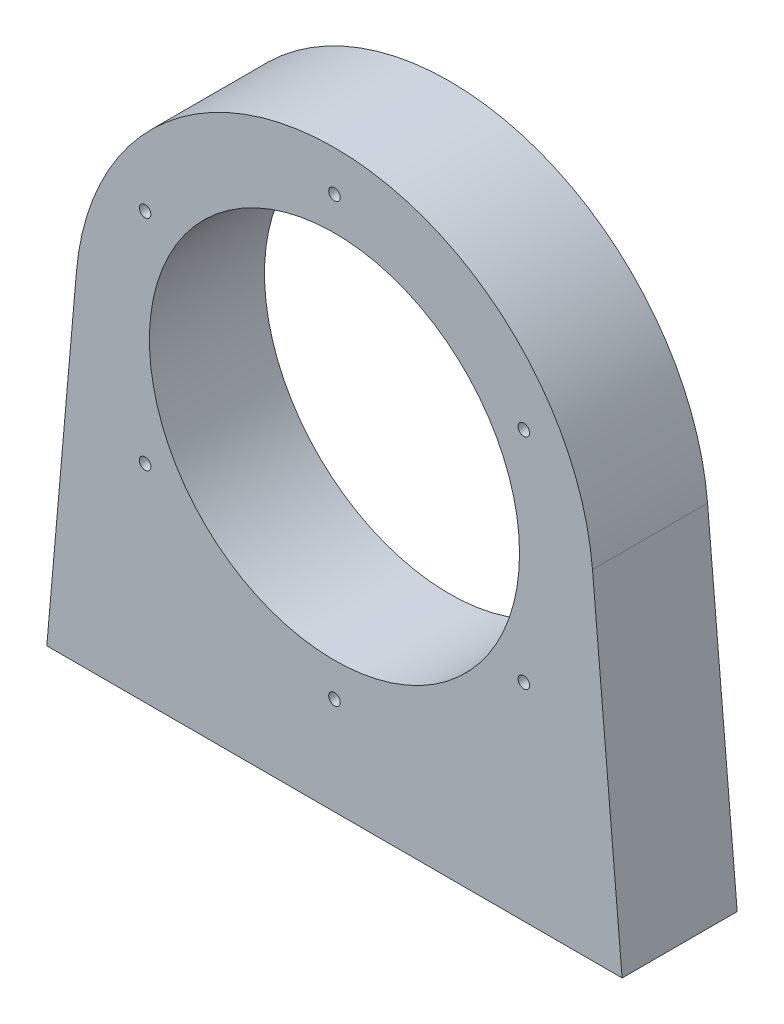
ISO-10303-21;
HEADER;
FILE_DESCRIPTION(('STEP AP214'),'2;1');
FILE_NAME('part.step','',(''),(''),'','','');
FILE_SCHEMA(('AUTOMOTIVE_DESIGN { 1 0 10303 214 1 1 1 1 }'));
ENDSEC;
DATA;
#1=APPLICATION_CONTEXT('core data for automotive mechanical design processes');
#2=APPLICATION_PROTOCOL_DEFINITION('international standard','automotive_design',2000,#1);
#3=PRODUCT_CONTEXT('',#1,'mechanical');
#4=PRODUCT('Part','Part','',(#3));
#5=PRODUCT_RELATED_PRODUCT_CATEGORY('part','',(#4));
#6=PRODUCT_DEFINITION_FORMATION('','',#4);
#7=PRODUCT_DEFINITION_CONTEXT('part definition',#1,'design');
#8=PRODUCT_DEFINITION('design','',#6,#7);
#9=PRODUCT_DEFINITION_SHAPE('','',#8);
#10=(LENGTH_UNIT() NAMED_UNIT(*) SI_UNIT(.MILLI.,.METRE.));
#11=(NAMED_UNIT(*) PLANE_ANGLE_UNIT() SI_UNIT($,.RADIAN.));
#12=(NAMED_UNIT(*) SI_UNIT($,.STERADIAN.) SOLID_ANGLE_UNIT());
#13=UNCERTAINTY_MEASURE_WITH_UNIT(LENGTH_MEASURE(1.E-05),#10,'distance_accuracy_value','');
#14=(GEOMETRIC_REPRESENTATION_CONTEXT(3) GLOBAL_UNCERTAINTY_ASSIGNED_CONTEXT((#13)) GLOBAL_UNIT_ASSIGNED_CONTEXT((#10,
#11,#12)) REPRESENTATION_CONTEXT('',''));
#15=CARTESIAN_POINT('',(0.,0.,0.));
#16=DIRECTION('',(0.,0.,1.));
#17=DIRECTION('',(1.,0.,0.));
#18=AXIS2_PLACEMENT_3D('',#15,#16,#17);
#19=CARTESIAN_POINT('',(148.861493596414,13.0184393729418,30.));
#20=DIRECTION('',(-0.996197750102571,-0.0871208510666442,0.));
#21=DIRECTION('',(0.0871208510666442,-0.996197750102571,0.));
#22=AXIS2_PLACEMENT_3D('',#19,#20,#21);
#23=PLANE('',#22);
#24=DIRECTION('',(-0.0871208510666443,0.996197750102571,0.));
#25=VECTOR('',#24,1.);
#26=CARTESIAN_POINT('',(148.861493596414,13.0184393729418,0.));
#27=LINE('',#26,#25);
#28=CARTESIAN_POINT('',(150.,0.,0.));
#29=VERTEX_POINT('',#28);
#30=CARTESIAN_POINT('',(142.273206422801,88.3532964023038,0.));
#31=VERTEX_POINT('',#30);
#32=EDGE_CURVE('E119',#29,#31,#27,.T.);
#33=ORIENTED_EDGE('',*,*,#32,.T.);
#34=DIRECTION('',(0.,0.,-1.));
#35=VECTOR('',#34,1.);
#36=CARTESIAN_POINT('',(142.273206422801,88.3532964023038,30.));
#37=LINE('',#36,#35);
#38=CARTESIAN_POINT('',(142.273206422801,88.3532964023038,30.));
#39=VERTEX_POINT('',#38);
#40=EDGE_CURVE('E11',#39,#31,#37,.T.);
#41=ORIENTED_EDGE('',*,*,#40,.F.);
#42=DIRECTION('',(-0.0871208510666443,0.996197750102571,0.));
#43=VECTOR('',#42,1.);
#44=CARTESIAN_POINT('',(148.861493596414,13.0184393729418,30.));
#45=LINE('',#44,#43);
#46=CARTESIAN_POINT('',(150.,0.,30.));
#47=VERTEX_POINT('',#46);
#48=EDGE_CURVE('E87',#47,#39,#45,.T.);
#49=ORIENTED_EDGE('',*,*,#48,.F.);
#50=DIRECTION('',(0.,0.,-1.));
#51=VECTOR('',#50,1.);
#52=CARTESIAN_POINT('',(150.,0.,30.));
#53=LINE('',#52,#51);
#54=EDGE_CURVE('E118',#47,#29,#53,.T.);
#55=ORIENTED_EDGE('',*,*,#54,.T.);
#56=EDGE_LOOP('',(#33,#41,#49,#55));
#57=FACE_BOUND('',#56,.T.);
#58=ADVANCED_FACE('F47',(#57),#23,.F.);
#59=CARTESIAN_POINT('',(75.,82.4700277471266,30.));
#60=DIRECTION('',(0.,0.,-1.));
#61=DIRECTION('',(-1.,0.,0.));
#62=AXIS2_PLACEMENT_3D('',#59,#60,#61);
#63=CYLINDRICAL_SURFACE('',#62,67.5299722528733);
#64=CARTESIAN_POINT('',(75.,82.4700277471266,0.));
#65=DIRECTION('',(0.,0.,1.));
#66=DIRECTION('',(1.,0.,0.));
#67=AXIS2_PLACEMENT_3D('',#64,#65,#66);
#68=CIRCLE('',#67,67.5299722528733);
#69=CARTESIAN_POINT('',(7.72679357719853,88.3532964023038,0.));
#70=VERTEX_POINT('',#69);
#71=EDGE_CURVE('E96',#70,#31,#68,.F.);
#72=ORIENTED_EDGE('',*,*,#71,.F.);
#73=DIRECTION('',(0.,0.,-1.));
#74=VECTOR('',#73,1.);
#75=CARTESIAN_POINT('',(7.72679357719853,88.3532964023038,30.));
#76=LINE('',#75,#74);
#77=CARTESIAN_POINT('',(7.72679357719853,88.3532964023038,30.));
#78=VERTEX_POINT('',#77);
#79=EDGE_CURVE('E56',#78,#70,#76,.T.);
#80=ORIENTED_EDGE('',*,*,#79,.F.);
#81=CARTESIAN_POINT('',(75.,82.4700277471266,30.));
#82=DIRECTION('',(0.,0.,1.));
#83=DIRECTION('',(1.,0.,0.));
#84=AXIS2_PLACEMENT_3D('',#81,#82,#83);
#85=CIRCLE('',#84,67.5299722528733);
#86=EDGE_CURVE('E94',#78,#39,#85,.F.);
#87=ORIENTED_EDGE('',*,*,#86,.T.);
#88=ORIENTED_EDGE('',*,*,#40,.T.);
#89=EDGE_LOOP('',(#72,#80,#87,#88));
#90=FACE_BOUND('',#89,.T.);
#91=ADVANCED_FACE('F93',(#90),#63,.T.);
#92=CARTESIAN_POINT('',(0.,0.,30.));
#93=DIRECTION('',(-0.996197750102571,0.0871208510666441,0.));
#94=DIRECTION('',(-0.0871208510666441,-0.996197750102571,0.));
#95=AXIS2_PLACEMENT_3D('',#92,#93,#94);
#96=PLANE('',#95);
#97=DIRECTION('',(0.0871208510666441,0.996197750102571,0.));
#98=VECTOR('',#97,1.);
#99=CARTESIAN_POINT('',(0.,0.,0.));
#100=LINE('',#99,#98);
#101=CARTESIAN_POINT('',(0.,0.,0.));
#102=VERTEX_POINT('',#101);
#103=EDGE_CURVE('E126',#102,#70,#100,.T.);
#104=ORIENTED_EDGE('',*,*,#103,.F.);
#105=DIRECTION('',(0.,0.,-1.));
#106=VECTOR('',#105,1.);
#107=CARTESIAN_POINT('',(0.,0.,30.));
#108=LINE('',#107,#106);
#109=CARTESIAN_POINT('',(0.,0.,30.));
#110=VERTEX_POINT('',#109);
#111=EDGE_CURVE('E79',#110,#102,#108,.T.);
#112=ORIENTED_EDGE('',*,*,#111,.F.);
#113=DIRECTION('',(0.0871208510666441,0.996197750102571,0.));
#114=VECTOR('',#113,1.);
#115=CARTESIAN_POINT('',(0.,0.,30.));
#116=LINE('',#115,#114);
#117=EDGE_CURVE('E104',#110,#78,#116,.T.);
#118=ORIENTED_EDGE('',*,*,#117,.T.);
#119=ORIENTED_EDGE('',*,*,#79,.T.);
#120=EDGE_LOOP('',(#104,#112,#118,#119));
#121=FACE_BOUND('',#120,.T.);
#122=ADVANCED_FACE('F107',(#121),#96,.T.);
#123=CARTESIAN_POINT('',(0.,0.,30.));
#124=DIRECTION('',(0.,1.,0.));
#125=DIRECTION('',(0.,0.,1.));
#126=AXIS2_PLACEMENT_3D('',#123,#124,#125);
#127=PLANE('',#126);
#128=DIRECTION('',(1.,0.,0.));
#129=VECTOR('',#128,1.);
#130=CARTESIAN_POINT('',(0.,0.,0.));
#131=LINE('',#130,#129);
#132=EDGE_CURVE('E82',#102,#29,#131,.T.);
#133=ORIENTED_EDGE('',*,*,#132,.T.);
#134=ORIENTED_EDGE('',*,*,#54,.F.);
#135=DIRECTION('',(1.,0.,0.));
#136=VECTOR('',#135,1.);
#137=CARTESIAN_POINT('',(0.,0.,30.));
#138=LINE('',#137,#136);
#139=EDGE_CURVE('E64',#110,#47,#138,.T.);
#140=ORIENTED_EDGE('',*,*,#139,.F.);
#141=ORIENTED_EDGE('',*,*,#111,.T.);
#142=EDGE_LOOP('',(#133,#134,#140,#141));
#143=FACE_BOUND('',#142,.T.);
#144=ADVANCED_FACE('F151',(#143),#127,.F.);
#145=CARTESIAN_POINT('',(75.,82.4700277471266,30.));
#146=DIRECTION('',(0.,0.,-1.));
#147=DIRECTION('',(-1.,0.,0.));
#148=AXIS2_PLACEMENT_3D('',#145,#146,#147);
#149=CYLINDRICAL_SURFACE('',#148,48.25);
#150=CARTESIAN_POINT('',(75.,82.4700277471266,30.));
#151=DIRECTION('',(0.,0.,1.));
#152=DIRECTION('',(1.,0.,0.));
#153=AXIS2_PLACEMENT_3D('',#150,#151,#152);
#154=CIRCLE('',#153,48.25);
#155=CARTESIAN_POINT('',(123.25,82.4700277471266,30.));
#156=VERTEX_POINT('',#155);
#157=EDGE_CURVE('E111',#156,#156,#154,.T.);
#158=ORIENTED_EDGE('',*,*,#157,.T.);
#159=EDGE_LOOP('',(#158));
#160=FACE_BOUND('',#159,.T.);
#161=CARTESIAN_POINT('',(75.,82.4700277471266,0.));
#162=DIRECTION('',(0.,0.,1.));
#163=DIRECTION('',(1.,0.,0.));
#164=AXIS2_PLACEMENT_3D('',#161,#162,#163);
#165=CIRCLE('',#164,48.25);
#166=CARTESIAN_POINT('',(123.25,82.4700277471266,0.));
#167=VERTEX_POINT('',#166);
#168=EDGE_CURVE('E131',#167,#167,#165,.T.);
#169=ORIENTED_EDGE('',*,*,#168,.F.);
#170=EDGE_LOOP('',(#169));
#171=FACE_BOUND('',#170,.T.);
#172=ADVANCED_FACE('F149',(#160,#171),#149,.F.);
#173=CARTESIAN_POINT('',(0.,0.,30.));
#174=DIRECTION('',(0.,0.,1.));
#175=DIRECTION('',(1.,0.,0.));
#176=AXIS2_PLACEMENT_3D('',#173,#174,#175);
#177=PLANE('',#176);
#178=CARTESIAN_POINT('',(75.,139.470027747127,30.));
#179=DIRECTION('',(0.,0.,1.));
#180=DIRECTION('',(1.,0.,0.));
#181=AXIS2_PLACEMENT_3D('',#178,#179,#180);
#182=CIRCLE('',#181,1.5);
#183=CARTESIAN_POINT('',(76.5,139.470027747127,30.));
#184=VERTEX_POINT('',#183);
#185=EDGE_CURVE('E264',#184,#184,#182,.T.);
#186=ORIENTED_EDGE('',*,*,#185,.F.);
#187=EDGE_LOOP('',(#186));
#188=FACE_BOUND('',#187,.T.);
#189=CARTESIAN_POINT('',(25.6365519842885,110.970027747125,30.));
#190=DIRECTION('',(0.,0.,1.));
#191=DIRECTION('',(1.,0.,0.));
#192=AXIS2_PLACEMENT_3D('',#189,#190,#191);
#193=CIRCLE('',#192,1.5);
#194=CARTESIAN_POINT('',(27.1365519842885,110.970027747125,30.));
#195=VERTEX_POINT('',#194);
#196=EDGE_CURVE('E277',#195,#195,#193,.T.);
#197=ORIENTED_EDGE('',*,*,#196,.F.);
#198=EDGE_LOOP('',(#197));
#199=FACE_BOUND('',#198,.T.);
#200=CARTESIAN_POINT('',(25.6365519842904,53.970027747125,30.));
#201=DIRECTION('',(0.,0.,1.));
#202=DIRECTION('',(1.,0.,0.));
#203=AXIS2_PLACEMENT_3D('',#200,#201,#202);
#204=CIRCLE('',#203,1.50000000000002);
#205=CARTESIAN_POINT('',(27.1365519842904,53.970027747125,30.));
#206=VERTEX_POINT('',#205);
#207=EDGE_CURVE('E302',#206,#206,#204,.T.);
#208=ORIENTED_EDGE('',*,*,#207,.F.);
#209=EDGE_LOOP('',(#208));
#210=FACE_BOUND('',#209,.T.);
#211=CARTESIAN_POINT('',(75.0000000000045,25.4700277471266,30.));
#212=DIRECTION('',(0.,0.,1.));
#213=DIRECTION('',(1.,0.,0.));
#214=AXIS2_PLACEMENT_3D('',#211,#212,#213);
#215=CIRCLE('',#214,1.5);
#216=CARTESIAN_POINT('',(76.5000000000045,25.4700277471266,30.));
#217=VERTEX_POINT('',#216);
#218=EDGE_CURVE('E294',#217,#217,#215,.T.);
#219=ORIENTED_EDGE('',*,*,#218,.F.);
#220=EDGE_LOOP('',(#219));
#221=FACE_BOUND('',#220,.T.);
#222=CARTESIAN_POINT('',(124.363448015717,53.9700277471285,30.));
#223=DIRECTION('',(0.,0.,1.));
#224=DIRECTION('',(1.,0.,0.));
#225=AXIS2_PLACEMENT_3D('',#222,#223,#224);
#226=CIRCLE('',#225,1.5);
#227=CARTESIAN_POINT('',(125.863448015717,53.9700277471285,30.));
#228=VERTEX_POINT('',#227);
#229=EDGE_CURVE('E286',#228,#228,#226,.T.);
#230=ORIENTED_EDGE('',*,*,#229,.F.);
#231=EDGE_LOOP('',(#230));
#232=FACE_BOUND('',#231,.T.);
#233=CARTESIAN_POINT('',(124.363448015714,110.970027747129,30.));
#234=DIRECTION('',(0.,0.,1.));
#235=DIRECTION('',(1.,0.,0.));
#236=AXIS2_PLACEMENT_3D('',#233,#234,#235);
#237=CIRCLE('',#236,1.49999999999998);
#238=CARTESIAN_POINT('',(125.863448015714,110.970027747129,30.));
#239=VERTEX_POINT('',#238);
#240=EDGE_CURVE('E270',#239,#239,#237,.T.);
#241=ORIENTED_EDGE('',*,*,#240,.F.);
#242=EDGE_LOOP('',(#241));
#243=FACE_BOUND('',#242,.T.);
#244=ORIENTED_EDGE('',*,*,#48,.T.);
#245=ORIENTED_EDGE('',*,*,#86,.F.);
#246=ORIENTED_EDGE('',*,*,#117,.F.);
#247=ORIENTED_EDGE('',*,*,#139,.T.);
#248=EDGE_LOOP('',(#244,#245,#246,#247));
#249=FACE_BOUND('',#248,.T.);
#250=ORIENTED_EDGE('',*,*,#157,.F.);
#251=EDGE_LOOP('',(#250));
#252=FACE_BOUND('',#251,.T.);
#253=ADVANCED_FACE('F102',(#188,#199,#210,#221,#232,#243,#249,#252),#177,.T.);
#254=CARTESIAN_POINT('',(0.,0.,0.));
#255=DIRECTION('',(0.,0.,1.));
#256=DIRECTION('',(1.,0.,0.));
#257=AXIS2_PLACEMENT_3D('',#254,#255,#256);
#258=PLANE('',#257);
#259=CARTESIAN_POINT('',(75.,139.470027747127,0.));
#260=DIRECTION('',(0.,0.,1.));
#261=DIRECTION('',(1.,0.,0.));
#262=AXIS2_PLACEMENT_3D('',#259,#260,#261);
#263=CIRCLE('',#262,1.5);
#264=CARTESIAN_POINT('',(76.5,139.470027747127,0.));
#265=VERTEX_POINT('',#264);
#266=EDGE_CURVE('E123',#265,#265,#263,.F.);
#267=ORIENTED_EDGE('',*,*,#266,.F.);
#268=EDGE_LOOP('',(#267));
#269=FACE_BOUND('',#268,.T.);
#270=CARTESIAN_POINT('',(25.6365519842885,110.970027747125,0.));
#271=DIRECTION('',(0.,0.,1.));
#272=DIRECTION('',(1.,0.,0.));
#273=AXIS2_PLACEMENT_3D('',#270,#271,#272);
#274=CIRCLE('',#273,1.5);
#275=CARTESIAN_POINT('',(27.1365519842885,110.970027747125,0.));
#276=VERTEX_POINT('',#275);
#277=EDGE_CURVE('E273',#276,#276,#274,.F.);
#278=ORIENTED_EDGE('',*,*,#277,.F.);
#279=EDGE_LOOP('',(#278));
#280=FACE_BOUND('',#279,.T.);
#281=CARTESIAN_POINT('',(25.6365519842904,53.970027747125,0.));
#282=DIRECTION('',(0.,0.,1.));
#283=DIRECTION('',(1.,0.,0.));
#284=AXIS2_PLACEMENT_3D('',#281,#282,#283);
#285=CIRCLE('',#284,1.50000000000002);
#286=CARTESIAN_POINT('',(27.1365519842904,53.970027747125,0.));
#287=VERTEX_POINT('',#286);
#288=EDGE_CURVE('E281',#287,#287,#285,.F.);
#289=ORIENTED_EDGE('',*,*,#288,.F.);
#290=EDGE_LOOP('',(#289));
#291=FACE_BOUND('',#290,.T.);
#292=CARTESIAN_POINT('',(75.0000000000045,25.4700277471266,0.));
#293=DIRECTION('',(0.,0.,1.));
#294=DIRECTION('',(1.,0.,0.));
#295=AXIS2_PLACEMENT_3D('',#292,#293,#294);
#296=CIRCLE('',#295,1.5);
#297=CARTESIAN_POINT('',(76.5000000000045,25.4700277471266,0.));
#298=VERTEX_POINT('',#297);
#299=EDGE_CURVE('E298',#298,#298,#296,.F.);
#300=ORIENTED_EDGE('',*,*,#299,.F.);
#301=EDGE_LOOP('',(#300));
#302=FACE_BOUND('',#301,.T.);
#303=CARTESIAN_POINT('',(124.363448015717,53.9700277471285,0.));
#304=DIRECTION('',(0.,0.,1.));
#305=DIRECTION('',(1.,0.,0.));
#306=AXIS2_PLACEMENT_3D('',#303,#304,#305);
#307=CIRCLE('',#306,1.5);
#308=CARTESIAN_POINT('',(125.863448015717,53.9700277471285,0.));
#309=VERTEX_POINT('',#308);
#310=EDGE_CURVE('E290',#309,#309,#307,.F.);
#311=ORIENTED_EDGE('',*,*,#310,.F.);
#312=EDGE_LOOP('',(#311));
#313=FACE_BOUND('',#312,.T.);
#314=CARTESIAN_POINT('',(124.363448015714,110.970027747129,0.));
#315=DIRECTION('',(0.,0.,1.));
#316=DIRECTION('',(1.,0.,0.));
#317=AXIS2_PLACEMENT_3D('',#314,#315,#316);
#318=CIRCLE('',#317,1.49999999999998);
#319=CARTESIAN_POINT('',(125.863448015714,110.970027747129,0.));
#320=VERTEX_POINT('',#319);
#321=EDGE_CURVE('E282',#320,#320,#318,.F.);
#322=ORIENTED_EDGE('',*,*,#321,.F.);
#323=EDGE_LOOP('',(#322));
#324=FACE_BOUND('',#323,.T.);
#325=ORIENTED_EDGE('',*,*,#32,.F.);
#326=ORIENTED_EDGE('',*,*,#132,.F.);
#327=ORIENTED_EDGE('',*,*,#103,.T.);
#328=ORIENTED_EDGE('',*,*,#71,.T.);
#329=EDGE_LOOP('',(#325,#326,#327,#328));
#330=FACE_BOUND('',#329,.T.);
#331=ORIENTED_EDGE('',*,*,#168,.T.);
#332=EDGE_LOOP('',(#331));
#333=FACE_BOUND('',#332,.T.);
#334=ADVANCED_FACE('F141',(#269,#280,#291,#302,#313,#324,#330,#333),#258,.F.);
#335=CARTESIAN_POINT('',(124.363448015714,110.970027747129,-0.001000000000001));
#336=DIRECTION('',(0.,0.,1.));
#337=DIRECTION('',(1.,0.,0.));
#338=AXIS2_PLACEMENT_3D('',#335,#336,#337);
#339=CYLINDRICAL_SURFACE('',#338,1.49999999999998);
#340=ORIENTED_EDGE('',*,*,#240,.T.);
#341=EDGE_LOOP('',(#340));
#342=FACE_BOUND('',#341,.T.);
#343=ORIENTED_EDGE('',*,*,#321,.T.);
#344=EDGE_LOOP('',(#343));
#345=FACE_BOUND('',#344,.T.);
#346=ADVANCED_FACE('F144',(#342,#345),#339,.F.);
#347=CARTESIAN_POINT('',(124.363448015717,53.9700277471285,-0.001000000000001));
#348=DIRECTION('',(0.,0.,1.));
#349=DIRECTION('',(1.,0.,0.));
#350=AXIS2_PLACEMENT_3D('',#347,#348,#349);
#351=CYLINDRICAL_SURFACE('',#350,1.5);
#352=ORIENTED_EDGE('',*,*,#229,.T.);
#353=EDGE_LOOP('',(#352));
#354=FACE_BOUND('',#353,.T.);
#355=ORIENTED_EDGE('',*,*,#310,.T.);
#356=EDGE_LOOP('',(#355));
#357=FACE_BOUND('',#356,.T.);
#358=ADVANCED_FACE('F208',(#354,#357),#351,.F.);
#359=CARTESIAN_POINT('',(75.0000000000045,25.4700277471266,-0.001000000000001));
#360=DIRECTION('',(0.,0.,1.));
#361=DIRECTION('',(1.,0.,0.));
#362=AXIS2_PLACEMENT_3D('',#359,#360,#361);
#363=CYLINDRICAL_SURFACE('',#362,1.5);
#364=ORIENTED_EDGE('',*,*,#218,.T.);
#365=EDGE_LOOP('',(#364));
#366=FACE_BOUND('',#365,.T.);
#367=ORIENTED_EDGE('',*,*,#299,.T.);
#368=EDGE_LOOP('',(#367));
#369=FACE_BOUND('',#368,.T.);
#370=ADVANCED_FACE('F218',(#366,#369),#363,.F.);
#371=CARTESIAN_POINT('',(25.6365519842904,53.970027747125,-0.001000000000001));
#372=DIRECTION('',(0.,0.,1.));
#373=DIRECTION('',(1.,0.,0.));
#374=AXIS2_PLACEMENT_3D('',#371,#372,#373);
#375=CYLINDRICAL_SURFACE('',#374,1.50000000000002);
#376=ORIENTED_EDGE('',*,*,#207,.T.);
#377=EDGE_LOOP('',(#376));
#378=FACE_BOUND('',#377,.T.);
#379=ORIENTED_EDGE('',*,*,#288,.T.);
#380=EDGE_LOOP('',(#379));
#381=FACE_BOUND('',#380,.T.);
#382=ADVANCED_FACE('F228',(#378,#381),#375,.F.);
#383=CARTESIAN_POINT('',(25.6365519842885,110.970027747125,-0.001000000000001));
#384=DIRECTION('',(0.,0.,1.));
#385=DIRECTION('',(1.,0.,0.));
#386=AXIS2_PLACEMENT_3D('',#383,#384,#385);
#387=CYLINDRICAL_SURFACE('',#386,1.5);
#388=ORIENTED_EDGE('',*,*,#196,.T.);
#389=EDGE_LOOP('',(#388));
#390=FACE_BOUND('',#389,.T.);
#391=ORIENTED_EDGE('',*,*,#277,.T.);
#392=EDGE_LOOP('',(#391));
#393=FACE_BOUND('',#392,.T.);
#394=ADVANCED_FACE('F238',(#390,#393),#387,.F.);
#395=CARTESIAN_POINT('',(75.,139.470027747127,-0.001000000000001));
#396=DIRECTION('',(0.,0.,1.));
#397=DIRECTION('',(1.,0.,0.));
#398=AXIS2_PLACEMENT_3D('',#395,#396,#397);
#399=CYLINDRICAL_SURFACE('',#398,1.5);
#400=ORIENTED_EDGE('',*,*,#185,.T.);
#401=EDGE_LOOP('',(#400));
#402=FACE_BOUND('',#401,.T.);
#403=ORIENTED_EDGE('',*,*,#266,.T.);
#404=EDGE_LOOP('',(#403));
#405=FACE_BOUND('',#404,.T.);
#406=ADVANCED_FACE('F248',(#402,#405),#399,.F.);
#407=CLOSED_SHELL('',(#58,#91,#122,#144,#172,#253,#334,#346,#358,#370,#382,#394,#406));
#408=MANIFOLD_SOLID_BREP('B2',#407);
#409=ADVANCED_BREP_SHAPE_REPRESENTATION('',(#18,#408),#14);
#410=SHAPE_DEFINITION_REPRESENTATION(#9,#409);
ENDSEC;
END-ISO-10303-21;
